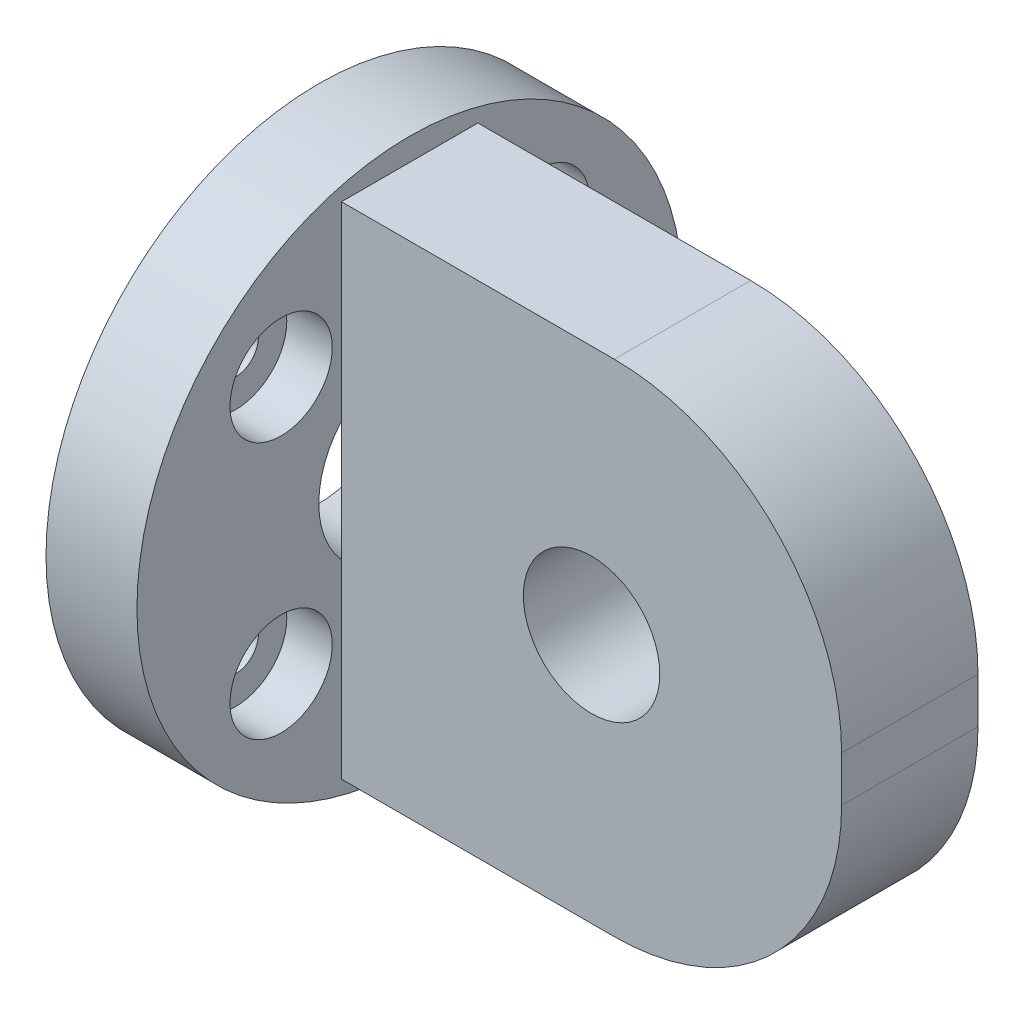
ISO-10303-21;
HEADER;
FILE_DESCRIPTION(('STEP AP214'),'2;1');
FILE_NAME('part.step','',(''),(''),'','','');
FILE_SCHEMA(('AUTOMOTIVE_DESIGN { 1 0 10303 214 1 1 1 1 }'));
ENDSEC;
DATA;
#1=APPLICATION_CONTEXT('core data for automotive mechanical design processes');
#2=APPLICATION_PROTOCOL_DEFINITION('international standard','automotive_design',2000,#1);
#3=PRODUCT_CONTEXT('',#1,'mechanical');
#4=PRODUCT('Part','Part','',(#3));
#5=PRODUCT_RELATED_PRODUCT_CATEGORY('part','',(#4));
#6=PRODUCT_DEFINITION_FORMATION('','',#4);
#7=PRODUCT_DEFINITION_CONTEXT('part definition',#1,'design');
#8=PRODUCT_DEFINITION('design','',#6,#7);
#9=PRODUCT_DEFINITION_SHAPE('','',#8);
#10=(LENGTH_UNIT() NAMED_UNIT(*) SI_UNIT(.MILLI.,.METRE.));
#11=(NAMED_UNIT(*) PLANE_ANGLE_UNIT() SI_UNIT($,.RADIAN.));
#12=(NAMED_UNIT(*) SI_UNIT($,.STERADIAN.) SOLID_ANGLE_UNIT());
#13=UNCERTAINTY_MEASURE_WITH_UNIT(LENGTH_MEASURE(1.E-05),#10,'distance_accuracy_value','');
#14=(GEOMETRIC_REPRESENTATION_CONTEXT(3) GLOBAL_UNCERTAINTY_ASSIGNED_CONTEXT((#13)) GLOBAL_UNIT_ASSIGNED_CONTEXT((#10,
#11,#12)) REPRESENTATION_CONTEXT('',''));
#15=CARTESIAN_POINT('',(0.,0.,0.));
#16=DIRECTION('',(0.,0.,1.));
#17=DIRECTION('',(1.,0.,0.));
#18=AXIS2_PLACEMENT_3D('',#15,#16,#17);
#19=CARTESIAN_POINT('',(4.,0.,0.));
#20=DIRECTION('',(1.,0.,0.));
#21=DIRECTION('',(0.,0.,-1.));
#22=AXIS2_PLACEMENT_3D('',#19,#20,#21);
#23=PLANE('',#22);
#24=CARTESIAN_POINT('',(4.,0.,0.));
#25=DIRECTION('',(1.,0.,0.));
#26=DIRECTION('',(0.,0.,-1.));
#27=AXIS2_PLACEMENT_3D('',#24,#25,#26);
#28=CIRCLE('',#27,4.);
#29=CARTESIAN_POINT('',(4.,-2.64575131106459,3.));
#30=VERTEX_POINT('',#29);
#31=CARTESIAN_POINT('',(4.,-2.64575131106459,-3.));
#32=VERTEX_POINT('',#31);
#33=EDGE_CURVE('E10',#30,#32,#28,.T.);
#34=ORIENTED_EDGE('',*,*,#33,.F.);
#35=DIRECTION('',(0.,-1.,0.));
#36=VECTOR('',#35,1.);
#37=CARTESIAN_POINT('',(4.,0.,3.));
#38=LINE('',#37,#36);
#39=CARTESIAN_POINT('',(4.,2.64575131106459,3.));
#40=VERTEX_POINT('',#39);
#41=EDGE_CURVE('E309',#40,#30,#38,.T.);
#42=ORIENTED_EDGE('',*,*,#41,.F.);
#43=CARTESIAN_POINT('',(4.,0.,0.));
#44=DIRECTION('',(1.,0.,0.));
#45=DIRECTION('',(0.,0.,-1.));
#46=AXIS2_PLACEMENT_3D('',#43,#44,#45);
#47=CIRCLE('',#46,4.);
#48=CARTESIAN_POINT('',(4.,2.64575131106459,-3.));
#49=VERTEX_POINT('',#48);
#50=EDGE_CURVE('E26',#49,#40,#47,.T.);
#51=ORIENTED_EDGE('',*,*,#50,.F.);
#52=DIRECTION('',(0.,-1.,0.));
#53=VECTOR('',#52,1.);
#54=CARTESIAN_POINT('',(4.,0.,-3.));
#55=LINE('',#54,#53);
#56=EDGE_CURVE('E298',#49,#32,#55,.T.);
#57=ORIENTED_EDGE('',*,*,#56,.T.);
#58=EDGE_LOOP('',(#34,#42,#51,#57));
#59=FACE_BOUND('',#58,.T.);
#60=ADVANCED_FACE('F16',(#59),#23,.F.);
#61=CARTESIAN_POINT('',(15.,0.,0.));
#62=DIRECTION('',(0.,0.,1.));
#63=DIRECTION('',(1.,0.,0.));
#64=AXIS2_PLACEMENT_3D('',#61,#62,#63);
#65=CYLINDRICAL_SURFACE('',#64,3.);
#66=CARTESIAN_POINT('',(15.,0.,-3.));
#67=DIRECTION('',(0.,0.,1.));
#68=DIRECTION('',(1.,0.,0.));
#69=AXIS2_PLACEMENT_3D('',#66,#67,#68);
#70=CIRCLE('',#69,3.);
#71=CARTESIAN_POINT('',(18.,0.,-3.));
#72=VERTEX_POINT('',#71);
#73=EDGE_CURVE('E312',#72,#72,#70,.T.);
#74=ORIENTED_EDGE('',*,*,#73,.F.);
#75=EDGE_LOOP('',(#74));
#76=FACE_BOUND('',#75,.T.);
#77=CARTESIAN_POINT('',(15.,0.,3.));
#78=DIRECTION('',(0.,0.,1.));
#79=DIRECTION('',(1.,0.,0.));
#80=AXIS2_PLACEMENT_3D('',#77,#78,#79);
#81=CIRCLE('',#80,3.);
#82=CARTESIAN_POINT('',(18.,0.,3.));
#83=VERTEX_POINT('',#82);
#84=EDGE_CURVE('E88',#83,#83,#81,.T.);
#85=ORIENTED_EDGE('',*,*,#84,.T.);
#86=EDGE_LOOP('',(#85));
#87=FACE_BOUND('',#86,.T.);
#88=ADVANCED_FACE('F191',(#76,#87),#65,.F.);
#89=CARTESIAN_POINT('',(2.,0.,0.));
#90=DIRECTION('',(1.,0.,0.));
#91=DIRECTION('',(0.,0.,-1.));
#92=AXIS2_PLACEMENT_3D('',#89,#90,#91);
#93=CYLINDRICAL_SURFACE('',#92,12.);
#94=CARTESIAN_POINT('',(4.,0.,0.));
#95=DIRECTION('',(1.,0.,0.));
#96=DIRECTION('',(0.,0.,-1.));
#97=AXIS2_PLACEMENT_3D('',#94,#95,#96);
#98=CIRCLE('',#97,12.);
#99=CARTESIAN_POINT('',(4.,0.,-12.));
#100=VERTEX_POINT('',#99);
#101=EDGE_CURVE('E315',#100,#100,#98,.T.);
#102=ORIENTED_EDGE('',*,*,#101,.F.);
#103=EDGE_LOOP('',(#102));
#104=FACE_BOUND('',#103,.T.);
#105=CARTESIAN_POINT('',(0.,0.,0.));
#106=DIRECTION('',(1.,0.,0.));
#107=DIRECTION('',(0.,0.,-1.));
#108=AXIS2_PLACEMENT_3D('',#105,#106,#107);
#109=CIRCLE('',#108,12.);
#110=CARTESIAN_POINT('',(0.,0.,-12.));
#111=VERTEX_POINT('',#110);
#112=EDGE_CURVE('E320',#111,#111,#109,.T.);
#113=ORIENTED_EDGE('',*,*,#112,.T.);
#114=EDGE_LOOP('',(#113));
#115=FACE_BOUND('',#114,.T.);
#116=ADVANCED_FACE('F197',(#104,#115),#93,.T.);
#117=CARTESIAN_POINT('',(0.,0.,0.));
#118=DIRECTION('',(1.,0.,0.));
#119=DIRECTION('',(0.,0.,-1.));
#120=AXIS2_PLACEMENT_3D('',#117,#118,#119);
#121=PLANE('',#120);
#122=ORIENTED_EDGE('',*,*,#112,.F.);
#123=EDGE_LOOP('',(#122));
#124=FACE_BOUND('',#123,.T.);
#125=CARTESIAN_POINT('',(0.,0.,0.));
#126=DIRECTION('',(1.,0.,0.));
#127=DIRECTION('',(0.,0.,-1.));
#128=AXIS2_PLACEMENT_3D('',#125,#126,#127);
#129=CIRCLE('',#128,4.);
#130=CARTESIAN_POINT('',(0.,0.,-4.));
#131=VERTEX_POINT('',#130);
#132=EDGE_CURVE('E279',#131,#131,#129,.T.);
#133=ORIENTED_EDGE('',*,*,#132,.T.);
#134=EDGE_LOOP('',(#133));
#135=FACE_BOUND('',#134,.T.);
#136=CARTESIAN_POINT('',(0.,5.65685424949239,-5.65685424949238));
#137=DIRECTION('',(1.,0.,0.));
#138=DIRECTION('',(0.,0.,-1.));
#139=AXIS2_PLACEMENT_3D('',#136,#137,#138);
#140=CIRCLE('',#139,1.);
#141=CARTESIAN_POINT('',(0.,5.65685424949239,-6.65685424949238));
#142=VERTEX_POINT('',#141);
#143=EDGE_CURVE('E117',#142,#142,#140,.T.);
#144=ORIENTED_EDGE('',*,*,#143,.T.);
#145=EDGE_LOOP('',(#144));
#146=FACE_BOUND('',#145,.T.);
#147=CARTESIAN_POINT('',(0.,5.65685424949238,5.65685424949238));
#148=DIRECTION('',(1.,0.,0.));
#149=DIRECTION('',(0.,0.,-1.));
#150=AXIS2_PLACEMENT_3D('',#147,#148,#149);
#151=CIRCLE('',#150,1.);
#152=CARTESIAN_POINT('',(0.,5.65685424949238,4.65685424949238));
#153=VERTEX_POINT('',#152);
#154=EDGE_CURVE('E261',#153,#153,#151,.T.);
#155=ORIENTED_EDGE('',*,*,#154,.T.);
#156=EDGE_LOOP('',(#155));
#157=FACE_BOUND('',#156,.T.);
#158=CARTESIAN_POINT('',(0.,-5.65685424949239,5.65685424949238));
#159=DIRECTION('',(1.,0.,0.));
#160=DIRECTION('',(0.,0.,-1.));
#161=AXIS2_PLACEMENT_3D('',#158,#159,#160);
#162=CIRCLE('',#161,1.);
#163=CARTESIAN_POINT('',(0.,-5.65685424949239,4.65685424949238));
#164=VERTEX_POINT('',#163);
#165=EDGE_CURVE('E259',#164,#164,#162,.T.);
#166=ORIENTED_EDGE('',*,*,#165,.T.);
#167=EDGE_LOOP('',(#166));
#168=FACE_BOUND('',#167,.T.);
#169=CARTESIAN_POINT('',(0.,-5.65685424949239,-5.65685424949238));
#170=DIRECTION('',(1.,0.,0.));
#171=DIRECTION('',(0.,0.,-1.));
#172=AXIS2_PLACEMENT_3D('',#169,#170,#171);
#173=CIRCLE('',#172,1.);
#174=CARTESIAN_POINT('',(0.,-5.65685424949239,-6.65685424949238));
#175=VERTEX_POINT('',#174);
#176=EDGE_CURVE('E89',#175,#175,#173,.T.);
#177=ORIENTED_EDGE('',*,*,#176,.T.);
#178=EDGE_LOOP('',(#177));
#179=FACE_BOUND('',#178,.T.);
#180=ADVANCED_FACE('F203',(#124,#135,#146,#157,#168,#179),#121,.F.);
#181=CARTESIAN_POINT('',(2.,0.,0.));
#182=DIRECTION('',(1.,0.,0.));
#183=DIRECTION('',(0.,0.,-1.));
#184=AXIS2_PLACEMENT_3D('',#181,#182,#183);
#185=CYLINDRICAL_SURFACE('',#184,4.);
#186=CARTESIAN_POINT('',(4.,0.,0.));
#187=DIRECTION('',(1.,0.,0.));
#188=DIRECTION('',(0.,0.,-1.));
#189=AXIS2_PLACEMENT_3D('',#186,#187,#188);
#190=CIRCLE('',#189,4.);
#191=EDGE_CURVE('E136',#32,#49,#190,.T.);
#192=ORIENTED_EDGE('',*,*,#191,.T.);
#193=ORIENTED_EDGE('',*,*,#50,.T.);
#194=CARTESIAN_POINT('',(4.,0.,0.));
#195=DIRECTION('',(1.,0.,0.));
#196=DIRECTION('',(0.,0.,-1.));
#197=AXIS2_PLACEMENT_3D('',#194,#195,#196);
#198=CIRCLE('',#197,4.);
#199=EDGE_CURVE('E112',#40,#30,#198,.T.);
#200=ORIENTED_EDGE('',*,*,#199,.T.);
#201=ORIENTED_EDGE('',*,*,#33,.T.);
#202=EDGE_LOOP('',(#192,#193,#200,#201));
#203=FACE_BOUND('',#202,.T.);
#204=ORIENTED_EDGE('',*,*,#132,.F.);
#205=EDGE_LOOP('',(#204));
#206=FACE_BOUND('',#205,.T.);
#207=ADVANCED_FACE('F207',(#203,#206),#185,.F.);
#208=CARTESIAN_POINT('',(3.99999999999999,11.,0.));
#209=DIRECTION('',(0.,1.,0.));
#210=DIRECTION('',(0.,0.,1.));
#211=AXIS2_PLACEMENT_3D('',#208,#209,#210);
#212=PLANE('',#211);
#213=DIRECTION('',(0.,0.,-1.));
#214=VECTOR('',#213,1.);
#215=CARTESIAN_POINT('',(16.,11.,0.));
#216=LINE('',#215,#214);
#217=CARTESIAN_POINT('',(16.,11.,3.));
#218=VERTEX_POINT('',#217);
#219=CARTESIAN_POINT('',(16.,11.,-3.));
#220=VERTEX_POINT('',#219);
#221=EDGE_CURVE('E271',#218,#220,#216,.T.);
#222=ORIENTED_EDGE('',*,*,#221,.T.);
#223=DIRECTION('',(-1.,0.,0.));
#224=VECTOR('',#223,1.);
#225=CARTESIAN_POINT('',(10.,11.,-3.));
#226=LINE('',#225,#224);
#227=CARTESIAN_POINT('',(4.,11.,-3.));
#228=VERTEX_POINT('',#227);
#229=EDGE_CURVE('E282',#220,#228,#226,.T.);
#230=ORIENTED_EDGE('',*,*,#229,.T.);
#231=DIRECTION('',(0.,0.,-1.));
#232=VECTOR('',#231,1.);
#233=CARTESIAN_POINT('',(3.99999999999999,11.,0.));
#234=LINE('',#233,#232);
#235=CARTESIAN_POINT('',(4.,11.,3.));
#236=VERTEX_POINT('',#235);
#237=EDGE_CURVE('E274',#236,#228,#234,.T.);
#238=ORIENTED_EDGE('',*,*,#237,.F.);
#239=DIRECTION('',(-1.,0.,0.));
#240=VECTOR('',#239,1.);
#241=CARTESIAN_POINT('',(10.,11.,3.));
#242=LINE('',#241,#240);
#243=EDGE_CURVE('E276',#218,#236,#242,.T.);
#244=ORIENTED_EDGE('',*,*,#243,.F.);
#245=EDGE_LOOP('',(#222,#230,#238,#244));
#246=FACE_BOUND('',#245,.T.);
#247=ADVANCED_FACE('F211',(#246),#212,.T.);
#248=CARTESIAN_POINT('',(16.,0.999999999999998,0.));
#249=DIRECTION('',(0.,0.,-1.));
#250=DIRECTION('',(-1.,0.,0.));
#251=AXIS2_PLACEMENT_3D('',#248,#249,#250);
#252=CYLINDRICAL_SURFACE('',#251,10.);
#253=DIRECTION('',(0.,0.,-1.));
#254=VECTOR('',#253,1.);
#255=CARTESIAN_POINT('',(26.,1.,0.));
#256=LINE('',#255,#254);
#257=CARTESIAN_POINT('',(26.,1.,3.));
#258=VERTEX_POINT('',#257);
#259=CARTESIAN_POINT('',(26.,1.,-3.));
#260=VERTEX_POINT('',#259);
#261=EDGE_CURVE('E95',#258,#260,#256,.T.);
#262=ORIENTED_EDGE('',*,*,#261,.T.);
#263=CARTESIAN_POINT('',(16.,0.999999999999998,-3.));
#264=DIRECTION('',(0.,0.,1.));
#265=DIRECTION('',(-1.,0.,0.));
#266=AXIS2_PLACEMENT_3D('',#263,#264,#265);
#267=CIRCLE('',#266,10.);
#268=EDGE_CURVE('E283',#260,#220,#267,.T.);
#269=ORIENTED_EDGE('',*,*,#268,.T.);
#270=ORIENTED_EDGE('',*,*,#221,.F.);
#271=CARTESIAN_POINT('',(16.,0.999999999999998,3.));
#272=DIRECTION('',(0.,0.,-1.));
#273=DIRECTION('',(-1.,0.,0.));
#274=AXIS2_PLACEMENT_3D('',#271,#272,#273);
#275=CIRCLE('',#274,10.);
#276=EDGE_CURVE('E105',#218,#258,#275,.T.);
#277=ORIENTED_EDGE('',*,*,#276,.T.);
#278=EDGE_LOOP('',(#262,#269,#270,#277));
#279=FACE_BOUND('',#278,.T.);
#280=ADVANCED_FACE('F214',(#279),#252,.T.);
#281=CARTESIAN_POINT('',(26.,-11.,0.));
#282=DIRECTION('',(0.,-1.,0.));
#283=DIRECTION('',(0.,0.,-1.));
#284=AXIS2_PLACEMENT_3D('',#281,#282,#283);
#285=PLANE('',#284);
#286=DIRECTION('',(0.,0.,-1.));
#287=VECTOR('',#286,1.);
#288=CARTESIAN_POINT('',(16.,-11.,0.));
#289=LINE('',#288,#287);
#290=CARTESIAN_POINT('',(16.,-11.,3.));
#291=VERTEX_POINT('',#290);
#292=CARTESIAN_POINT('',(16.,-11.,-3.));
#293=VERTEX_POINT('',#292);
#294=EDGE_CURVE('E275',#291,#293,#289,.T.);
#295=ORIENTED_EDGE('',*,*,#294,.F.);
#296=DIRECTION('',(1.,0.,0.));
#297=VECTOR('',#296,1.);
#298=CARTESIAN_POINT('',(10.,-11.,3.));
#299=LINE('',#298,#297);
#300=CARTESIAN_POINT('',(4.,-11.,3.));
#301=VERTEX_POINT('',#300);
#302=EDGE_CURVE('E103',#301,#291,#299,.T.);
#303=ORIENTED_EDGE('',*,*,#302,.F.);
#304=DIRECTION('',(0.,0.,-1.));
#305=VECTOR('',#304,1.);
#306=CARTESIAN_POINT('',(4.,-11.,0.));
#307=LINE('',#306,#305);
#308=CARTESIAN_POINT('',(4.,-11.,-3.));
#309=VERTEX_POINT('',#308);
#310=EDGE_CURVE('E113',#301,#309,#307,.T.);
#311=ORIENTED_EDGE('',*,*,#310,.T.);
#312=DIRECTION('',(1.,0.,0.));
#313=VECTOR('',#312,1.);
#314=CARTESIAN_POINT('',(10.,-11.,-3.));
#315=LINE('',#314,#313);
#316=EDGE_CURVE('E290',#309,#293,#315,.T.);
#317=ORIENTED_EDGE('',*,*,#316,.T.);
#318=EDGE_LOOP('',(#295,#303,#311,#317));
#319=FACE_BOUND('',#318,.T.);
#320=ADVANCED_FACE('F218',(#319),#285,.T.);
#321=CARTESIAN_POINT('',(0.,0.,-3.));
#322=DIRECTION('',(0.,0.,1.));
#323=DIRECTION('',(1.,0.,0.));
#324=AXIS2_PLACEMENT_3D('',#321,#322,#323);
#325=PLANE('',#324);
#326=DIRECTION('',(0.,1.,0.));
#327=VECTOR('',#326,1.);
#328=CARTESIAN_POINT('',(26.,0.,-3.));
#329=LINE('',#328,#327);
#330=CARTESIAN_POINT('',(26.,-1.,-3.));
#331=VERTEX_POINT('',#330);
#332=EDGE_CURVE('E288',#331,#260,#329,.T.);
#333=ORIENTED_EDGE('',*,*,#332,.F.);
#334=CARTESIAN_POINT('',(16.,-1.,-3.));
#335=DIRECTION('',(0.,0.,1.));
#336=DIRECTION('',(1.,0.,0.));
#337=AXIS2_PLACEMENT_3D('',#334,#335,#336);
#338=CIRCLE('',#337,10.);
#339=EDGE_CURVE('E77',#293,#331,#338,.T.);
#340=ORIENTED_EDGE('',*,*,#339,.F.);
#341=ORIENTED_EDGE('',*,*,#316,.F.);
#342=DIRECTION('',(0.,-1.,0.));
#343=VECTOR('',#342,1.);
#344=CARTESIAN_POINT('',(4.,-6.8228756555323,-3.));
#345=LINE('',#344,#343);
#346=EDGE_CURVE('E292',#32,#309,#345,.T.);
#347=ORIENTED_EDGE('',*,*,#346,.F.);
#348=ORIENTED_EDGE('',*,*,#56,.F.);
#349=DIRECTION('',(0.,-1.,0.));
#350=VECTOR('',#349,1.);
#351=CARTESIAN_POINT('',(4.,6.82287565553229,-3.));
#352=LINE('',#351,#350);
#353=EDGE_CURVE('E284',#228,#49,#352,.T.);
#354=ORIENTED_EDGE('',*,*,#353,.F.);
#355=ORIENTED_EDGE('',*,*,#229,.F.);
#356=ORIENTED_EDGE('',*,*,#268,.F.);
#357=EDGE_LOOP('',(#333,#340,#341,#347,#348,#354,#355,#356));
#358=FACE_BOUND('',#357,.T.);
#359=ORIENTED_EDGE('',*,*,#73,.T.);
#360=EDGE_LOOP('',(#359));
#361=FACE_BOUND('',#360,.T.);
#362=ADVANCED_FACE('F222',(#358,#361),#325,.F.);
#363=CARTESIAN_POINT('',(26.,-11.,0.));
#364=DIRECTION('',(-1.,0.,0.));
#365=DIRECTION('',(0.,0.,1.));
#366=AXIS2_PLACEMENT_3D('',#363,#364,#365);
#367=PLANE('',#366);
#368=DIRECTION('',(0.,1.,0.));
#369=VECTOR('',#368,1.);
#370=CARTESIAN_POINT('',(26.,0.,3.));
#371=LINE('',#370,#369);
#372=CARTESIAN_POINT('',(26.,-1.,3.));
#373=VERTEX_POINT('',#372);
#374=EDGE_CURVE('E93',#373,#258,#371,.T.);
#375=ORIENTED_EDGE('',*,*,#374,.F.);
#376=DIRECTION('',(0.,0.,-1.));
#377=VECTOR('',#376,1.);
#378=CARTESIAN_POINT('',(26.,-1.,0.));
#379=LINE('',#378,#377);
#380=EDGE_CURVE('E81',#373,#331,#379,.T.);
#381=ORIENTED_EDGE('',*,*,#380,.T.);
#382=ORIENTED_EDGE('',*,*,#332,.T.);
#383=ORIENTED_EDGE('',*,*,#261,.F.);
#384=EDGE_LOOP('',(#375,#381,#382,#383));
#385=FACE_BOUND('',#384,.T.);
#386=ADVANCED_FACE('F94',(#385),#367,.F.);
#387=CARTESIAN_POINT('',(0.,0.,3.));
#388=DIRECTION('',(0.,0.,1.));
#389=DIRECTION('',(1.,0.,0.));
#390=AXIS2_PLACEMENT_3D('',#387,#388,#389);
#391=PLANE('',#390);
#392=CARTESIAN_POINT('',(16.,-1.,3.));
#393=DIRECTION('',(0.,0.,-1.));
#394=DIRECTION('',(1.,0.,0.));
#395=AXIS2_PLACEMENT_3D('',#392,#393,#394);
#396=CIRCLE('',#395,10.);
#397=EDGE_CURVE('E85',#373,#291,#396,.T.);
#398=ORIENTED_EDGE('',*,*,#397,.F.);
#399=ORIENTED_EDGE('',*,*,#374,.T.);
#400=ORIENTED_EDGE('',*,*,#276,.F.);
#401=ORIENTED_EDGE('',*,*,#243,.T.);
#402=DIRECTION('',(0.,-1.,0.));
#403=VECTOR('',#402,1.);
#404=CARTESIAN_POINT('',(4.,6.82287565553229,3.));
#405=LINE('',#404,#403);
#406=EDGE_CURVE('E114',#236,#40,#405,.T.);
#407=ORIENTED_EDGE('',*,*,#406,.T.);
#408=ORIENTED_EDGE('',*,*,#41,.T.);
#409=DIRECTION('',(0.,-1.,0.));
#410=VECTOR('',#409,1.);
#411=CARTESIAN_POINT('',(4.,-6.8228756555323,3.));
#412=LINE('',#411,#410);
#413=EDGE_CURVE('E110',#30,#301,#412,.T.);
#414=ORIENTED_EDGE('',*,*,#413,.T.);
#415=ORIENTED_EDGE('',*,*,#302,.T.);
#416=EDGE_LOOP('',(#398,#399,#400,#401,#407,#408,#414,#415));
#417=FACE_BOUND('',#416,.T.);
#418=ORIENTED_EDGE('',*,*,#84,.F.);
#419=EDGE_LOOP('',(#418));
#420=FACE_BOUND('',#419,.T.);
#421=ADVANCED_FACE('F99',(#417,#420),#391,.T.);
#422=CARTESIAN_POINT('',(16.,-1.,0.));
#423=DIRECTION('',(0.,0.,-1.));
#424=DIRECTION('',(-1.,0.,0.));
#425=AXIS2_PLACEMENT_3D('',#422,#423,#424);
#426=CYLINDRICAL_SURFACE('',#425,10.);
#427=ORIENTED_EDGE('',*,*,#294,.T.);
#428=ORIENTED_EDGE('',*,*,#339,.T.);
#429=ORIENTED_EDGE('',*,*,#380,.F.);
#430=ORIENTED_EDGE('',*,*,#397,.T.);
#431=EDGE_LOOP('',(#427,#428,#429,#430));
#432=FACE_BOUND('',#431,.T.);
#433=ADVANCED_FACE('F83',(#432),#426,.T.);
#434=CARTESIAN_POINT('',(2.,-5.65685424949239,-5.65685424949238));
#435=DIRECTION('',(1.,0.,0.));
#436=DIRECTION('',(0.,0.,-1.));
#437=AXIS2_PLACEMENT_3D('',#434,#435,#436);
#438=CYLINDRICAL_SURFACE('',#437,1.);
#439=CARTESIAN_POINT('',(2.,-5.65685424949239,-5.65685424949238));
#440=DIRECTION('',(1.,0.,0.));
#441=DIRECTION('',(0.,0.,-1.));
#442=AXIS2_PLACEMENT_3D('',#439,#440,#441);
#443=CIRCLE('',#442,1.);
#444=CARTESIAN_POINT('',(2.,-5.65685424949239,-6.65685424949238));
#445=VERTEX_POINT('',#444);
#446=EDGE_CURVE('E118',#445,#445,#443,.T.);
#447=ORIENTED_EDGE('',*,*,#446,.T.);
#448=EDGE_LOOP('',(#447));
#449=FACE_BOUND('',#448,.T.);
#450=ORIENTED_EDGE('',*,*,#176,.F.);
#451=EDGE_LOOP('',(#450));
#452=FACE_BOUND('',#451,.T.);
#453=ADVANCED_FACE('F233',(#449,#452),#438,.F.);
#454=CARTESIAN_POINT('',(2.,-5.65685424949239,5.65685424949238));
#455=DIRECTION('',(1.,0.,0.));
#456=DIRECTION('',(0.,0.,-1.));
#457=AXIS2_PLACEMENT_3D('',#454,#455,#456);
#458=CYLINDRICAL_SURFACE('',#457,1.);
#459=CARTESIAN_POINT('',(2.,-5.65685424949239,5.65685424949238));
#460=DIRECTION('',(1.,0.,0.));
#461=DIRECTION('',(0.,0.,-1.));
#462=AXIS2_PLACEMENT_3D('',#459,#460,#461);
#463=CIRCLE('',#462,1.);
#464=CARTESIAN_POINT('',(2.,-5.65685424949239,4.65685424949238));
#465=VERTEX_POINT('',#464);
#466=EDGE_CURVE('E123',#465,#465,#463,.T.);
#467=ORIENTED_EDGE('',*,*,#466,.T.);
#468=EDGE_LOOP('',(#467));
#469=FACE_BOUND('',#468,.T.);
#470=ORIENTED_EDGE('',*,*,#165,.F.);
#471=EDGE_LOOP('',(#470));
#472=FACE_BOUND('',#471,.T.);
#473=ADVANCED_FACE('F236',(#469,#472),#458,.F.);
#474=CARTESIAN_POINT('',(2.,5.65685424949238,5.65685424949238));
#475=DIRECTION('',(1.,0.,0.));
#476=DIRECTION('',(0.,0.,-1.));
#477=AXIS2_PLACEMENT_3D('',#474,#475,#476);
#478=CYLINDRICAL_SURFACE('',#477,1.);
#479=CARTESIAN_POINT('',(2.,5.65685424949238,5.65685424949238));
#480=DIRECTION('',(1.,0.,0.));
#481=DIRECTION('',(0.,0.,-1.));
#482=AXIS2_PLACEMENT_3D('',#479,#480,#481);
#483=CIRCLE('',#482,1.);
#484=CARTESIAN_POINT('',(2.,5.65685424949238,4.65685424949238));
#485=VERTEX_POINT('',#484);
#486=EDGE_CURVE('E127',#485,#485,#483,.T.);
#487=ORIENTED_EDGE('',*,*,#486,.T.);
#488=EDGE_LOOP('',(#487));
#489=FACE_BOUND('',#488,.T.);
#490=ORIENTED_EDGE('',*,*,#154,.F.);
#491=EDGE_LOOP('',(#490));
#492=FACE_BOUND('',#491,.T.);
#493=ADVANCED_FACE('F240',(#489,#492),#478,.F.);
#494=CARTESIAN_POINT('',(2.,5.65685424949239,-5.65685424949238));
#495=DIRECTION('',(1.,0.,0.));
#496=DIRECTION('',(0.,0.,-1.));
#497=AXIS2_PLACEMENT_3D('',#494,#495,#496);
#498=CYLINDRICAL_SURFACE('',#497,1.);
#499=CARTESIAN_POINT('',(2.,5.65685424949239,-5.65685424949238));
#500=DIRECTION('',(1.,0.,0.));
#501=DIRECTION('',(0.,0.,-1.));
#502=AXIS2_PLACEMENT_3D('',#499,#500,#501);
#503=CIRCLE('',#502,1.);
#504=CARTESIAN_POINT('',(2.,5.65685424949239,-6.65685424949238));
#505=VERTEX_POINT('',#504);
#506=EDGE_CURVE('E130',#505,#505,#503,.T.);
#507=ORIENTED_EDGE('',*,*,#506,.T.);
#508=EDGE_LOOP('',(#507));
#509=FACE_BOUND('',#508,.T.);
#510=ORIENTED_EDGE('',*,*,#143,.F.);
#511=EDGE_LOOP('',(#510));
#512=FACE_BOUND('',#511,.T.);
#513=ADVANCED_FACE('F166',(#509,#512),#498,.F.);
#514=CARTESIAN_POINT('',(4.,0.,0.));
#515=DIRECTION('',(1.,0.,0.));
#516=DIRECTION('',(0.,0.,-1.));
#517=AXIS2_PLACEMENT_3D('',#514,#515,#516);
#518=PLANE('',#517);
#519=ORIENTED_EDGE('',*,*,#101,.T.);
#520=EDGE_LOOP('',(#519));
#521=FACE_BOUND('',#520,.T.);
#522=ORIENTED_EDGE('',*,*,#353,.T.);
#523=ORIENTED_EDGE('',*,*,#191,.F.);
#524=ORIENTED_EDGE('',*,*,#346,.T.);
#525=ORIENTED_EDGE('',*,*,#310,.F.);
#526=ORIENTED_EDGE('',*,*,#413,.F.);
#527=ORIENTED_EDGE('',*,*,#199,.F.);
#528=ORIENTED_EDGE('',*,*,#406,.F.);
#529=ORIENTED_EDGE('',*,*,#237,.T.);
#530=EDGE_LOOP('',(#522,#523,#524,#525,#526,#527,#528,#529));
#531=FACE_BOUND('',#530,.T.);
#532=CARTESIAN_POINT('',(4.,5.65685424949239,5.65685424949238));
#533=DIRECTION('',(1.,0.,0.));
#534=DIRECTION('',(0.,0.,-1.));
#535=AXIS2_PLACEMENT_3D('',#532,#533,#534);
#536=CIRCLE('',#535,2.25);
#537=CARTESIAN_POINT('',(4.,5.65685424949239,3.40685424949238));
#538=VERTEX_POINT('',#537);
#539=EDGE_CURVE('E133',#538,#538,#536,.T.);
#540=ORIENTED_EDGE('',*,*,#539,.F.);
#541=EDGE_LOOP('',(#540));
#542=FACE_BOUND('',#541,.T.);
#543=CARTESIAN_POINT('',(4.,-5.65685424949238,5.65685424949238));
#544=DIRECTION('',(1.,0.,0.));
#545=DIRECTION('',(0.,0.,-1.));
#546=AXIS2_PLACEMENT_3D('',#543,#544,#545);
#547=CIRCLE('',#546,2.25);
#548=CARTESIAN_POINT('',(4.,-5.65685424949238,3.40685424949238));
#549=VERTEX_POINT('',#548);
#550=EDGE_CURVE('E137',#549,#549,#547,.T.);
#551=ORIENTED_EDGE('',*,*,#550,.F.);
#552=EDGE_LOOP('',(#551));
#553=FACE_BOUND('',#552,.T.);
#554=CARTESIAN_POINT('',(4.,5.65685424949238,-5.65685424949238));
#555=DIRECTION('',(1.,0.,0.));
#556=DIRECTION('',(0.,0.,-1.));
#557=AXIS2_PLACEMENT_3D('',#554,#555,#556);
#558=CIRCLE('',#557,2.25);
#559=CARTESIAN_POINT('',(4.,5.65685424949238,-7.90685424949238));
#560=VERTEX_POINT('',#559);
#561=EDGE_CURVE('E140',#560,#560,#558,.T.);
#562=ORIENTED_EDGE('',*,*,#561,.F.);
#563=EDGE_LOOP('',(#562));
#564=FACE_BOUND('',#563,.T.);
#565=CARTESIAN_POINT('',(4.,-5.65685424949239,-5.65685424949238));
#566=DIRECTION('',(1.,0.,0.));
#567=DIRECTION('',(0.,0.,-1.));
#568=AXIS2_PLACEMENT_3D('',#565,#566,#567);
#569=CIRCLE('',#568,2.25);
#570=CARTESIAN_POINT('',(4.,-5.65685424949239,-7.90685424949238));
#571=VERTEX_POINT('',#570);
#572=EDGE_CURVE('E143',#571,#571,#569,.T.);
#573=ORIENTED_EDGE('',*,*,#572,.F.);
#574=EDGE_LOOP('',(#573));
#575=FACE_BOUND('',#574,.T.);
#576=ADVANCED_FACE('F162',(#521,#531,#542,#553,#564,#575),#518,.T.);
#577=CARTESIAN_POINT('',(3.,-5.65685424949238,5.65685424949238));
#578=DIRECTION('',(1.,0.,0.));
#579=DIRECTION('',(0.,0.,-1.));
#580=AXIS2_PLACEMENT_3D('',#577,#578,#579);
#581=CYLINDRICAL_SURFACE('',#580,2.25);
#582=CARTESIAN_POINT('',(2.,-5.65685424949238,5.65685424949238));
#583=DIRECTION('',(1.,0.,0.));
#584=DIRECTION('',(0.,0.,-1.));
#585=AXIS2_PLACEMENT_3D('',#582,#583,#584);
#586=CIRCLE('',#585,2.25);
#587=CARTESIAN_POINT('',(2.,-5.65685424949238,3.40685424949238));
#588=VERTEX_POINT('',#587);
#589=EDGE_CURVE('E126',#588,#588,#586,.T.);
#590=ORIENTED_EDGE('',*,*,#589,.F.);
#591=EDGE_LOOP('',(#590));
#592=FACE_BOUND('',#591,.T.);
#593=ORIENTED_EDGE('',*,*,#550,.T.);
#594=EDGE_LOOP('',(#593));
#595=FACE_BOUND('',#594,.T.);
#596=ADVANCED_FACE('F165',(#592,#595),#581,.F.);
#597=CARTESIAN_POINT('',(2.,0.,0.));
#598=DIRECTION('',(1.,0.,0.));
#599=DIRECTION('',(0.,0.,-1.));
#600=AXIS2_PLACEMENT_3D('',#597,#598,#599);
#601=PLANE('',#600);
#602=ORIENTED_EDGE('',*,*,#589,.T.);
#603=EDGE_LOOP('',(#602));
#604=FACE_BOUND('',#603,.T.);
#605=ORIENTED_EDGE('',*,*,#466,.F.);
#606=EDGE_LOOP('',(#605));
#607=FACE_BOUND('',#606,.T.);
#608=ADVANCED_FACE('F177',(#604,#607),#601,.T.);
#609=CARTESIAN_POINT('',(3.,-5.65685424949239,-5.65685424949238));
#610=DIRECTION('',(1.,0.,0.));
#611=DIRECTION('',(0.,0.,-1.));
#612=AXIS2_PLACEMENT_3D('',#609,#610,#611);
#613=CYLINDRICAL_SURFACE('',#612,2.25);
#614=CARTESIAN_POINT('',(2.,-5.65685424949239,-5.65685424949238));
#615=DIRECTION('',(1.,0.,0.));
#616=DIRECTION('',(0.,0.,-1.));
#617=AXIS2_PLACEMENT_3D('',#614,#615,#616);
#618=CIRCLE('',#617,2.25);
#619=CARTESIAN_POINT('',(2.,-5.65685424949239,-7.90685424949238));
#620=VERTEX_POINT('',#619);
#621=EDGE_CURVE('E121',#620,#620,#618,.T.);
#622=ORIENTED_EDGE('',*,*,#621,.F.);
#623=EDGE_LOOP('',(#622));
#624=FACE_BOUND('',#623,.T.);
#625=ORIENTED_EDGE('',*,*,#572,.T.);
#626=EDGE_LOOP('',(#625));
#627=FACE_BOUND('',#626,.T.);
#628=ADVANCED_FACE('F175',(#624,#627),#613,.F.);
#629=CARTESIAN_POINT('',(2.,0.,0.));
#630=DIRECTION('',(1.,0.,0.));
#631=DIRECTION('',(0.,0.,-1.));
#632=AXIS2_PLACEMENT_3D('',#629,#630,#631);
#633=PLANE('',#632);
#634=ORIENTED_EDGE('',*,*,#621,.T.);
#635=EDGE_LOOP('',(#634));
#636=FACE_BOUND('',#635,.T.);
#637=ORIENTED_EDGE('',*,*,#446,.F.);
#638=EDGE_LOOP('',(#637));
#639=FACE_BOUND('',#638,.T.);
#640=ADVANCED_FACE('F158',(#636,#639),#633,.T.);
#641=CARTESIAN_POINT('',(3.,5.65685424949239,5.65685424949238));
#642=DIRECTION('',(1.,0.,0.));
#643=DIRECTION('',(0.,0.,-1.));
#644=AXIS2_PLACEMENT_3D('',#641,#642,#643);
#645=CYLINDRICAL_SURFACE('',#644,2.25);
#646=CARTESIAN_POINT('',(2.,5.65685424949239,5.65685424949238));
#647=DIRECTION('',(1.,0.,0.));
#648=DIRECTION('',(0.,0.,-1.));
#649=AXIS2_PLACEMENT_3D('',#646,#647,#648);
#650=CIRCLE('',#649,2.25);
#651=CARTESIAN_POINT('',(2.,5.65685424949239,3.40685424949238));
#652=VERTEX_POINT('',#651);
#653=EDGE_CURVE('E122',#652,#652,#650,.T.);
#654=ORIENTED_EDGE('',*,*,#653,.F.);
#655=EDGE_LOOP('',(#654));
#656=FACE_BOUND('',#655,.T.);
#657=ORIENTED_EDGE('',*,*,#539,.T.);
#658=EDGE_LOOP('',(#657));
#659=FACE_BOUND('',#658,.T.);
#660=ADVANCED_FACE('F155',(#656,#659),#645,.F.);
#661=CARTESIAN_POINT('',(2.,0.,0.));
#662=DIRECTION('',(1.,0.,0.));
#663=DIRECTION('',(0.,0.,-1.));
#664=AXIS2_PLACEMENT_3D('',#661,#662,#663);
#665=PLANE('',#664);
#666=ORIENTED_EDGE('',*,*,#653,.T.);
#667=EDGE_LOOP('',(#666));
#668=FACE_BOUND('',#667,.T.);
#669=ORIENTED_EDGE('',*,*,#486,.F.);
#670=EDGE_LOOP('',(#669));
#671=FACE_BOUND('',#670,.T.);
#672=ADVANCED_FACE('F152',(#668,#671),#665,.T.);
#673=CARTESIAN_POINT('',(3.,5.65685424949238,-5.65685424949238));
#674=DIRECTION('',(1.,0.,0.));
#675=DIRECTION('',(0.,0.,-1.));
#676=AXIS2_PLACEMENT_3D('',#673,#674,#675);
#677=CYLINDRICAL_SURFACE('',#676,2.25);
#678=CARTESIAN_POINT('',(2.,5.65685424949238,-5.65685424949238));
#679=DIRECTION('',(1.,0.,0.));
#680=DIRECTION('',(0.,0.,-1.));
#681=AXIS2_PLACEMENT_3D('',#678,#679,#680);
#682=CIRCLE('',#681,2.25);
#683=CARTESIAN_POINT('',(2.,5.65685424949238,-7.90685424949238));
#684=VERTEX_POINT('',#683);
#685=EDGE_CURVE('E20',#684,#684,#682,.T.);
#686=ORIENTED_EDGE('',*,*,#685,.F.);
#687=EDGE_LOOP('',(#686));
#688=FACE_BOUND('',#687,.T.);
#689=ORIENTED_EDGE('',*,*,#561,.T.);
#690=EDGE_LOOP('',(#689));
#691=FACE_BOUND('',#690,.T.);
#692=ADVANCED_FACE('F388',(#688,#691),#677,.F.);
#693=CARTESIAN_POINT('',(2.,0.,0.));
#694=DIRECTION('',(1.,0.,0.));
#695=DIRECTION('',(0.,0.,-1.));
#696=AXIS2_PLACEMENT_3D('',#693,#694,#695);
#697=PLANE('',#696);
#698=ORIENTED_EDGE('',*,*,#685,.T.);
#699=EDGE_LOOP('',(#698));
#700=FACE_BOUND('',#699,.T.);
#701=ORIENTED_EDGE('',*,*,#506,.F.);
#702=EDGE_LOOP('',(#701));
#703=FACE_BOUND('',#702,.T.);
#704=ADVANCED_FACE('F18',(#700,#703),#697,.T.);
#705=CLOSED_SHELL('',(#60,#88,#116,#180,#207,#247,#280,#320,#362,#386,#421,#433,#453,#473,#493,
#513,#576,#596,#608,#628,#640,#660,#672,#692,#704));
#706=MANIFOLD_SOLID_BREP('B1',#705);
#707=ADVANCED_BREP_SHAPE_REPRESENTATION('',(#18,#706),#14);
#708=SHAPE_DEFINITION_REPRESENTATION(#9,#707);
ENDSEC;
END-ISO-10303-21;
